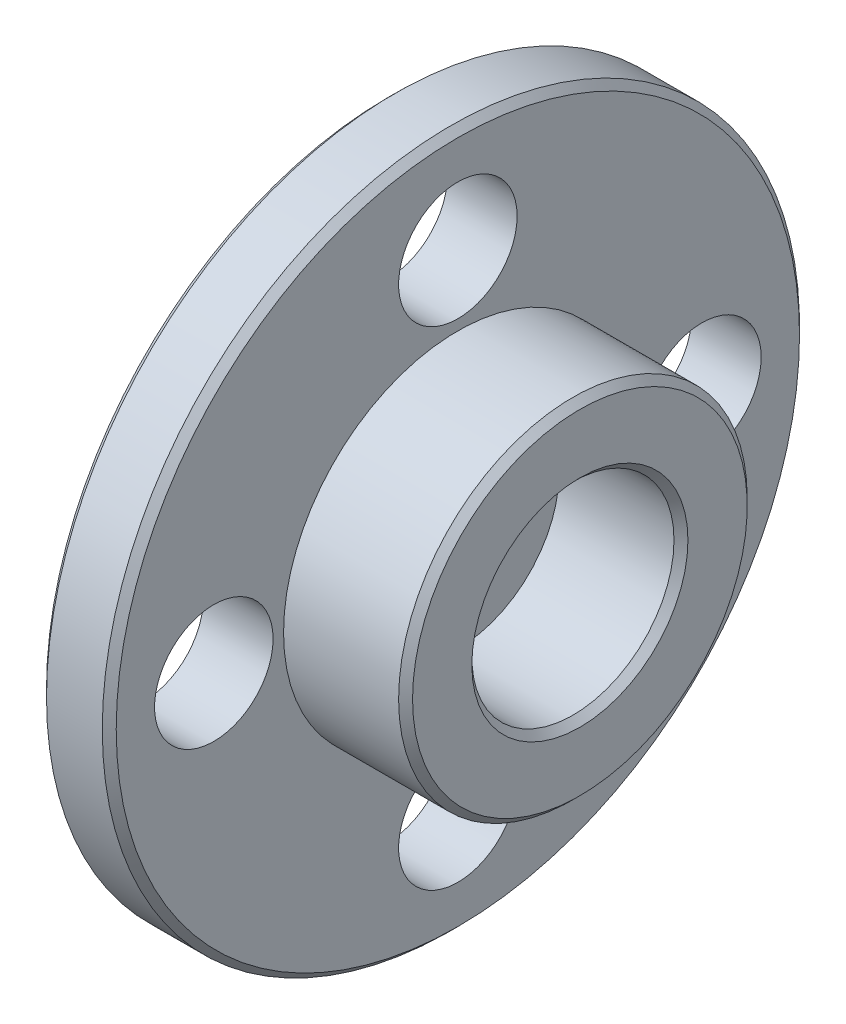
ISO-10303-21;
HEADER;
FILE_DESCRIPTION(('STEP AP214'),'2;1');
FILE_NAME('part.step','',(''),(''),'','','');
FILE_SCHEMA(('AUTOMOTIVE_DESIGN { 1 0 10303 214 1 1 1 1 }'));
ENDSEC;
DATA;
#1=APPLICATION_CONTEXT('core data for automotive mechanical design processes');
#2=APPLICATION_PROTOCOL_DEFINITION('international standard','automotive_design',2000,#1);
#3=PRODUCT_CONTEXT('',#1,'mechanical');
#4=PRODUCT('Part','Part','',(#3));
#5=PRODUCT_RELATED_PRODUCT_CATEGORY('part','',(#4));
#6=PRODUCT_DEFINITION_FORMATION('','',#4);
#7=PRODUCT_DEFINITION_CONTEXT('part definition',#1,'design');
#8=PRODUCT_DEFINITION('design','',#6,#7);
#9=PRODUCT_DEFINITION_SHAPE('','',#8);
#10=(LENGTH_UNIT() NAMED_UNIT(*) SI_UNIT(.MILLI.,.METRE.));
#11=(NAMED_UNIT(*) PLANE_ANGLE_UNIT() SI_UNIT($,.RADIAN.));
#12=(NAMED_UNIT(*) SI_UNIT($,.STERADIAN.) SOLID_ANGLE_UNIT());
#13=UNCERTAINTY_MEASURE_WITH_UNIT(LENGTH_MEASURE(1.E-05),#10,'distance_accuracy_value','');
#14=(GEOMETRIC_REPRESENTATION_CONTEXT(3) GLOBAL_UNCERTAINTY_ASSIGNED_CONTEXT((#13)) GLOBAL_UNIT_ASSIGNED_CONTEXT((#10,
#11,#12)) REPRESENTATION_CONTEXT('',''));
#15=CARTESIAN_POINT('',(0.,0.,0.));
#16=DIRECTION('',(0.,0.,1.));
#17=DIRECTION('',(1.,0.,0.));
#18=AXIS2_PLACEMENT_3D('',#15,#16,#17);
#19=CARTESIAN_POINT('',(0.,0.,0.));
#20=DIRECTION('',(1.,0.,0.));
#21=DIRECTION('',(0.,0.,-1.));
#22=AXIS2_PLACEMENT_3D('',#19,#20,#21);
#23=PLANE('',#22);
#24=CARTESIAN_POINT('',(0.,0.,0.));
#25=DIRECTION('',(1.,0.,0.));
#26=DIRECTION('',(0.,0.,-1.));
#27=AXIS2_PLACEMENT_3D('',#24,#25,#26);
#28=CIRCLE('',#27,1.70000000000002);
#29=CARTESIAN_POINT('',(0.,0.,-1.70000000000002));
#30=VERTEX_POINT('',#29);
#31=EDGE_CURVE('E63',#30,#30,#28,.T.);
#32=ORIENTED_EDGE('',*,*,#31,.T.);
#33=EDGE_LOOP('',(#32));
#34=FACE_BOUND('',#33,.T.);
#35=CARTESIAN_POINT('',(0.,0.,0.));
#36=DIRECTION('',(1.,0.,0.));
#37=DIRECTION('',(0.,0.,-1.));
#38=AXIS2_PLACEMENT_3D('',#35,#36,#37);
#39=CIRCLE('',#38,9.8);
#40=CARTESIAN_POINT('',(0.,0.,-9.8));
#41=VERTEX_POINT('',#40);
#42=EDGE_CURVE('E66',#41,#41,#39,.F.);
#43=ORIENTED_EDGE('',*,*,#42,.T.);
#44=EDGE_LOOP('',(#43));
#45=FACE_BOUND('',#44,.T.);
#46=CARTESIAN_POINT('',(0.,7.,0.));
#47=DIRECTION('',(1.,0.,0.));
#48=DIRECTION('',(0.,0.,-1.));
#49=AXIS2_PLACEMENT_3D('',#46,#47,#48);
#50=CIRCLE('',#49,1.7);
#51=CARTESIAN_POINT('',(0.,7.,-1.7));
#52=VERTEX_POINT('',#51);
#53=EDGE_CURVE('E99',#52,#52,#50,.T.);
#54=ORIENTED_EDGE('',*,*,#53,.T.);
#55=EDGE_LOOP('',(#54));
#56=FACE_BOUND('',#55,.T.);
#57=CARTESIAN_POINT('',(0.,-7.,0.));
#58=DIRECTION('',(1.,0.,0.));
#59=DIRECTION('',(0.,0.,-1.));
#60=AXIS2_PLACEMENT_3D('',#57,#58,#59);
#61=CIRCLE('',#60,1.7);
#62=CARTESIAN_POINT('',(0.,-7.,-1.7));
#63=VERTEX_POINT('',#62);
#64=EDGE_CURVE('E93',#63,#63,#61,.T.);
#65=ORIENTED_EDGE('',*,*,#64,.T.);
#66=EDGE_LOOP('',(#65));
#67=FACE_BOUND('',#66,.T.);
#68=CARTESIAN_POINT('',(0.,0.,7.));
#69=DIRECTION('',(1.,0.,0.));
#70=DIRECTION('',(0.,0.,-1.));
#71=AXIS2_PLACEMENT_3D('',#68,#69,#70);
#72=CIRCLE('',#71,1.7);
#73=CARTESIAN_POINT('',(0.,0.,5.3));
#74=VERTEX_POINT('',#73);
#75=EDGE_CURVE('E87',#74,#74,#72,.T.);
#76=ORIENTED_EDGE('',*,*,#75,.T.);
#77=EDGE_LOOP('',(#76));
#78=FACE_BOUND('',#77,.T.);
#79=CARTESIAN_POINT('',(0.,0.,-7.));
#80=DIRECTION('',(1.,0.,0.));
#81=DIRECTION('',(0.,0.,-1.));
#82=AXIS2_PLACEMENT_3D('',#79,#80,#81);
#83=CIRCLE('',#82,1.7);
#84=CARTESIAN_POINT('',(0.,0.,-8.7));
#85=VERTEX_POINT('',#84);
#86=EDGE_CURVE('E81',#85,#85,#83,.T.);
#87=ORIENTED_EDGE('',*,*,#86,.T.);
#88=EDGE_LOOP('',(#87));
#89=FACE_BOUND('',#88,.T.);
#90=ADVANCED_FACE('F34',(#34,#45,#56,#67,#78,#89),#23,.F.);
#91=CARTESIAN_POINT('',(0.,0.,0.));
#92=DIRECTION('',(-1.,0.,0.));
#93=DIRECTION('',(0.,0.,1.));
#94=AXIS2_PLACEMENT_3D('',#91,#92,#93);
#95=CYLINDRICAL_SURFACE('',#94,10.);
#96=CARTESIAN_POINT('',(0.200000000000002,0.,0.));
#97=DIRECTION('',(1.,0.,0.));
#98=DIRECTION('',(0.,0.,-1.));
#99=AXIS2_PLACEMENT_3D('',#96,#97,#98);
#100=CIRCLE('',#99,10.);
#101=CARTESIAN_POINT('',(0.200000000000002,0.,-10.));
#102=VERTEX_POINT('',#101);
#103=EDGE_CURVE('E41',#102,#102,#100,.T.);
#104=ORIENTED_EDGE('',*,*,#103,.T.);
#105=EDGE_LOOP('',(#104));
#106=FACE_BOUND('',#105,.T.);
#107=CARTESIAN_POINT('',(1.8,0.,0.));
#108=DIRECTION('',(-1.,0.,0.));
#109=DIRECTION('',(0.,0.,1.));
#110=AXIS2_PLACEMENT_3D('',#107,#108,#109);
#111=CIRCLE('',#110,10.);
#112=CARTESIAN_POINT('',(1.8,0.,10.));
#113=VERTEX_POINT('',#112);
#114=EDGE_CURVE('E45',#113,#113,#111,.T.);
#115=ORIENTED_EDGE('',*,*,#114,.T.);
#116=EDGE_LOOP('',(#115));
#117=FACE_BOUND('',#116,.T.);
#118=ADVANCED_FACE('F113',(#106,#117),#95,.T.);
#119=CARTESIAN_POINT('',(2.,10.,0.));
#120=DIRECTION('',(-1.,0.,0.));
#121=DIRECTION('',(0.,0.,1.));
#122=AXIS2_PLACEMENT_3D('',#119,#120,#121);
#123=PLANE('',#122);
#124=CARTESIAN_POINT('',(2.,0.,0.));
#125=DIRECTION('',(-1.,0.,0.));
#126=DIRECTION('',(0.,0.,1.));
#127=AXIS2_PLACEMENT_3D('',#124,#125,#126);
#128=CIRCLE('',#127,9.8);
#129=CARTESIAN_POINT('',(2.,0.,9.8));
#130=VERTEX_POINT('',#129);
#131=EDGE_CURVE('E10',#130,#130,#128,.F.);
#132=ORIENTED_EDGE('',*,*,#131,.T.);
#133=EDGE_LOOP('',(#132));
#134=FACE_BOUND('',#133,.T.);
#135=CARTESIAN_POINT('',(2.,7.,0.));
#136=DIRECTION('',(1.,0.,0.));
#137=DIRECTION('',(0.,0.,-1.));
#138=AXIS2_PLACEMENT_3D('',#135,#136,#137);
#139=CIRCLE('',#138,1.7);
#140=CARTESIAN_POINT('',(2.,7.,-1.7));
#141=VERTEX_POINT('',#140);
#142=EDGE_CURVE('E102',#141,#141,#139,.T.);
#143=ORIENTED_EDGE('',*,*,#142,.F.);
#144=EDGE_LOOP('',(#143));
#145=FACE_BOUND('',#144,.T.);
#146=CARTESIAN_POINT('',(2.,-7.,0.));
#147=DIRECTION('',(1.,0.,0.));
#148=DIRECTION('',(0.,0.,-1.));
#149=AXIS2_PLACEMENT_3D('',#146,#147,#148);
#150=CIRCLE('',#149,1.7);
#151=CARTESIAN_POINT('',(2.,-7.,-1.7));
#152=VERTEX_POINT('',#151);
#153=EDGE_CURVE('E96',#152,#152,#150,.T.);
#154=ORIENTED_EDGE('',*,*,#153,.F.);
#155=EDGE_LOOP('',(#154));
#156=FACE_BOUND('',#155,.T.);
#157=CARTESIAN_POINT('',(2.,0.,7.));
#158=DIRECTION('',(1.,0.,0.));
#159=DIRECTION('',(0.,0.,-1.));
#160=AXIS2_PLACEMENT_3D('',#157,#158,#159);
#161=CIRCLE('',#160,1.7);
#162=CARTESIAN_POINT('',(2.,0.,5.3));
#163=VERTEX_POINT('',#162);
#164=EDGE_CURVE('E90',#163,#163,#161,.T.);
#165=ORIENTED_EDGE('',*,*,#164,.F.);
#166=EDGE_LOOP('',(#165));
#167=FACE_BOUND('',#166,.T.);
#168=CARTESIAN_POINT('',(2.,0.,-7.));
#169=DIRECTION('',(1.,0.,0.));
#170=DIRECTION('',(0.,0.,-1.));
#171=AXIS2_PLACEMENT_3D('',#168,#169,#170);
#172=CIRCLE('',#171,1.7);
#173=CARTESIAN_POINT('',(2.,0.,-8.7));
#174=VERTEX_POINT('',#173);
#175=EDGE_CURVE('E84',#174,#174,#172,.T.);
#176=ORIENTED_EDGE('',*,*,#175,.F.);
#177=EDGE_LOOP('',(#176));
#178=FACE_BOUND('',#177,.T.);
#179=CARTESIAN_POINT('',(2.,0.,0.));
#180=DIRECTION('',(-1.,0.,0.));
#181=DIRECTION('',(0.,0.,1.));
#182=AXIS2_PLACEMENT_3D('',#179,#180,#181);
#183=CIRCLE('',#182,5.);
#184=CARTESIAN_POINT('',(2.,0.,5.));
#185=VERTEX_POINT('',#184);
#186=EDGE_CURVE('E72',#185,#185,#183,.T.);
#187=ORIENTED_EDGE('',*,*,#186,.T.);
#188=EDGE_LOOP('',(#187));
#189=FACE_BOUND('',#188,.T.);
#190=ADVANCED_FACE('F109',(#134,#145,#156,#167,#178,#189),#123,.F.);
#191=CARTESIAN_POINT('',(0.,0.,0.));
#192=DIRECTION('',(-1.,0.,0.));
#193=DIRECTION('',(0.,0.,1.));
#194=AXIS2_PLACEMENT_3D('',#191,#192,#193);
#195=CYLINDRICAL_SURFACE('',#194,5.);
#196=CARTESIAN_POINT('',(5.3,0.,0.));
#197=DIRECTION('',(-1.,0.,0.));
#198=DIRECTION('',(0.,0.,1.));
#199=AXIS2_PLACEMENT_3D('',#196,#197,#198);
#200=CIRCLE('',#199,5.);
#201=CARTESIAN_POINT('',(5.3,0.,5.));
#202=VERTEX_POINT('',#201);
#203=EDGE_CURVE('E49',#202,#202,#200,.T.);
#204=ORIENTED_EDGE('',*,*,#203,.T.);
#205=EDGE_LOOP('',(#204));
#206=FACE_BOUND('',#205,.T.);
#207=ORIENTED_EDGE('',*,*,#186,.F.);
#208=EDGE_LOOP('',(#207));
#209=FACE_BOUND('',#208,.T.);
#210=ADVANCED_FACE('F112',(#206,#209),#195,.T.);
#211=CARTESIAN_POINT('',(5.5,5.,0.));
#212=DIRECTION('',(-1.,0.,0.));
#213=DIRECTION('',(0.,0.,1.));
#214=AXIS2_PLACEMENT_3D('',#211,#212,#213);
#215=PLANE('',#214);
#216=CARTESIAN_POINT('',(5.5,0.,0.));
#217=DIRECTION('',(-1.,0.,0.));
#218=DIRECTION('',(0.,0.,1.));
#219=AXIS2_PLACEMENT_3D('',#216,#217,#218);
#220=CIRCLE('',#219,3.1);
#221=CARTESIAN_POINT('',(5.5,0.,-3.1));
#222=VERTEX_POINT('',#221);
#223=EDGE_CURVE('E54',#222,#222,#220,.T.);
#224=ORIENTED_EDGE('',*,*,#223,.T.);
#225=EDGE_LOOP('',(#224));
#226=FACE_BOUND('',#225,.T.);
#227=CARTESIAN_POINT('',(5.5,0.,0.));
#228=DIRECTION('',(-1.,0.,0.));
#229=DIRECTION('',(0.,0.,1.));
#230=AXIS2_PLACEMENT_3D('',#227,#228,#229);
#231=CIRCLE('',#230,4.8);
#232=CARTESIAN_POINT('',(5.5,0.,4.8));
#233=VERTEX_POINT('',#232);
#234=EDGE_CURVE('E57',#233,#233,#231,.F.);
#235=ORIENTED_EDGE('',*,*,#234,.T.);
#236=EDGE_LOOP('',(#235));
#237=FACE_BOUND('',#236,.T.);
#238=ADVANCED_FACE('F124',(#226,#237),#215,.F.);
#239=CARTESIAN_POINT('',(2.,0.,0.));
#240=DIRECTION('',(1.,0.,0.));
#241=DIRECTION('',(0.,0.,-1.));
#242=AXIS2_PLACEMENT_3D('',#239,#240,#241);
#243=CYLINDRICAL_SURFACE('',#242,2.9);
#244=CARTESIAN_POINT('',(5.30000000000001,0.,0.));
#245=DIRECTION('',(-1.,0.,0.));
#246=DIRECTION('',(0.,0.,1.));
#247=AXIS2_PLACEMENT_3D('',#244,#245,#246);
#248=CIRCLE('',#247,2.9);
#249=CARTESIAN_POINT('',(5.30000000000001,0.,-2.9));
#250=VERTEX_POINT('',#249);
#251=EDGE_CURVE('E60',#250,#250,#248,.F.);
#252=ORIENTED_EDGE('',*,*,#251,.T.);
#253=EDGE_LOOP('',(#252));
#254=FACE_BOUND('',#253,.T.);
#255=CARTESIAN_POINT('',(2.,0.,0.));
#256=DIRECTION('',(1.,0.,0.));
#257=DIRECTION('',(0.,0.,-1.));
#258=AXIS2_PLACEMENT_3D('',#255,#256,#257);
#259=CIRCLE('',#258,2.9);
#260=CARTESIAN_POINT('',(2.,0.,-2.9));
#261=VERTEX_POINT('',#260);
#262=EDGE_CURVE('E75',#261,#261,#259,.T.);
#263=ORIENTED_EDGE('',*,*,#262,.F.);
#264=EDGE_LOOP('',(#263));
#265=FACE_BOUND('',#264,.T.);
#266=ADVANCED_FACE('F130',(#254,#265),#243,.F.);
#267=CARTESIAN_POINT('',(2.,0.,0.));
#268=DIRECTION('',(1.,0.,0.));
#269=DIRECTION('',(0.,0.,-1.));
#270=AXIS2_PLACEMENT_3D('',#267,#268,#269);
#271=PLANE('',#270);
#272=CARTESIAN_POINT('',(2.,0.,0.));
#273=DIRECTION('',(1.,0.,0.));
#274=DIRECTION('',(0.,0.,-1.));
#275=AXIS2_PLACEMENT_3D('',#272,#273,#274);
#276=CIRCLE('',#275,1.5);
#277=CARTESIAN_POINT('',(2.,0.,1.5));
#278=VERTEX_POINT('',#277);
#279=EDGE_CURVE('E78',#278,#278,#276,.F.);
#280=ORIENTED_EDGE('',*,*,#279,.T.);
#281=EDGE_LOOP('',(#280));
#282=FACE_BOUND('',#281,.T.);
#283=ORIENTED_EDGE('',*,*,#262,.T.);
#284=EDGE_LOOP('',(#283));
#285=FACE_BOUND('',#284,.T.);
#286=ADVANCED_FACE('F184',(#282,#285),#271,.T.);
#287=CARTESIAN_POINT('',(5.501,0.,0.));
#288=DIRECTION('',(-1.,0.,0.));
#289=DIRECTION('',(0.,0.,1.));
#290=AXIS2_PLACEMENT_3D('',#287,#288,#289);
#291=CYLINDRICAL_SURFACE('',#290,1.5);
#292=CARTESIAN_POINT('',(0.200000000000019,0.,0.));
#293=DIRECTION('',(1.,0.,0.));
#294=DIRECTION('',(0.,0.,-1.));
#295=AXIS2_PLACEMENT_3D('',#292,#293,#294);
#296=CIRCLE('',#295,1.5);
#297=CARTESIAN_POINT('',(0.200000000000018,0.,1.5));
#298=VERTEX_POINT('',#297);
#299=EDGE_CURVE('E69',#298,#298,#296,.F.);
#300=CARTESIAN_POINT('',(0.200000000000018,0.,1.5));
#301=CARTESIAN_POINT('',(0.218750000000018,0.,1.5));
#302=CARTESIAN_POINT('',(0.237500000000017,0.,1.5));
#303=CARTESIAN_POINT('',(0.275000000000017,0.,1.5));
#304=CARTESIAN_POINT('',(0.293750000000017,0.,1.5));
#305=CARTESIAN_POINT('',(0.331250000000017,0.,1.5));
#306=CARTESIAN_POINT('',(0.350000000000017,0.,1.5));
#307=CARTESIAN_POINT('',(0.387500000000016,0.,1.5));
#308=CARTESIAN_POINT('',(0.406250000000016,0.,1.5));
#309=CARTESIAN_POINT('',(0.443750000000015,0.,1.5));
#310=CARTESIAN_POINT('',(0.462500000000015,0.,1.5));
#311=CARTESIAN_POINT('',(0.500000000000015,0.,1.5));
#312=CARTESIAN_POINT('',(0.518750000000015,0.,1.5));
#313=CARTESIAN_POINT('',(0.556250000000015,0.,1.5));
#314=CARTESIAN_POINT('',(0.575000000000014,0.,1.5));
#315=CARTESIAN_POINT('',(0.612500000000014,0.,1.5));
#316=CARTESIAN_POINT('',(0.631250000000014,0.,1.5));
#317=CARTESIAN_POINT('',(0.668750000000013,0.,1.5));
#318=CARTESIAN_POINT('',(0.687500000000013,0.,1.5));
#319=CARTESIAN_POINT('',(0.725000000000012,0.,1.5));
#320=CARTESIAN_POINT('',(0.743750000000012,0.,1.5));
#321=CARTESIAN_POINT('',(0.781250000000012,0.,1.5));
#322=CARTESIAN_POINT('',(0.800000000000012,0.,1.5));
#323=CARTESIAN_POINT('',(0.837500000000012,0.,1.5));
#324=CARTESIAN_POINT('',(0.856250000000012,0.,1.5));
#325=CARTESIAN_POINT('',(0.893750000000011,0.,1.5));
#326=CARTESIAN_POINT('',(0.912500000000011,0.,1.5));
#327=CARTESIAN_POINT('',(0.95000000000001,0.,1.5));
#328=CARTESIAN_POINT('',(0.96875000000001,0.,1.5));
#329=CARTESIAN_POINT('',(1.00625000000001,0.,1.5));
#330=CARTESIAN_POINT('',(1.02500000000001,0.,1.5));
#331=CARTESIAN_POINT('',(1.06250000000001,0.,1.5));
#332=CARTESIAN_POINT('',(1.08125000000001,0.,1.5));
#333=CARTESIAN_POINT('',(1.11875000000001,0.,1.5));
#334=CARTESIAN_POINT('',(1.13750000000001,0.,1.5));
#335=CARTESIAN_POINT('',(1.17500000000001,0.,1.5));
#336=CARTESIAN_POINT('',(1.19375000000001,0.,1.5));
#337=CARTESIAN_POINT('',(1.23125000000001,0.,1.5));
#338=CARTESIAN_POINT('',(1.25000000000001,0.,1.5));
#339=CARTESIAN_POINT('',(1.28750000000001,0.,1.5));
#340=CARTESIAN_POINT('',(1.30625000000001,0.,1.5));
#341=CARTESIAN_POINT('',(1.34375000000001,0.,1.5));
#342=CARTESIAN_POINT('',(1.36250000000001,0.,1.5));
#343=CARTESIAN_POINT('',(1.40000000000001,0.,1.5));
#344=CARTESIAN_POINT('',(1.41875000000001,0.,1.5));
#345=CARTESIAN_POINT('',(1.45625000000001,0.,1.5));
#346=CARTESIAN_POINT('',(1.47500000000001,0.,1.5));
#347=CARTESIAN_POINT('',(1.51250000000001,0.,1.5));
#348=CARTESIAN_POINT('',(1.53125,0.,1.5));
#349=CARTESIAN_POINT('',(1.56875,0.,1.5));
#350=CARTESIAN_POINT('',(1.5875,0.,1.5));
#351=CARTESIAN_POINT('',(1.625,0.,1.5));
#352=CARTESIAN_POINT('',(1.64375,0.,1.5));
#353=CARTESIAN_POINT('',(1.68125,0.,1.5));
#354=CARTESIAN_POINT('',(1.7,0.,1.5));
#355=CARTESIAN_POINT('',(1.7375,0.,1.5));
#356=CARTESIAN_POINT('',(1.75625,0.,1.5));
#357=CARTESIAN_POINT('',(1.79375,0.,1.5));
#358=CARTESIAN_POINT('',(1.8125,0.,1.5));
#359=CARTESIAN_POINT('',(1.85,0.,1.5));
#360=CARTESIAN_POINT('',(1.86875,0.,1.5));
#361=CARTESIAN_POINT('',(1.90625,0.,1.5));
#362=CARTESIAN_POINT('',(1.925,0.,1.5));
#363=CARTESIAN_POINT('',(1.9625,0.,1.5));
#364=CARTESIAN_POINT('',(1.98125,0.,1.5));
#365=CARTESIAN_POINT('',(2.,0.,1.5));
#366=B_SPLINE_CURVE_WITH_KNOTS('',3,(#300,#301,#302,#303,#304,#305,#306,#307,#308,#309,#310,
#311,#312,#313,#314,#315,#316,#317,#318,#319,#320,#321,#322,#323,#324,#325,#326,#327,#328,#329,
#330,#331,#332,#333,#334,#335,#336,#337,#338,#339,#340,#341,#342,#343,#344,#345,#346,#347,#348,
#349,#350,#351,#352,#353,#354,#355,#356,#357,#358,#359,#360,#361,#362,#363,#364,#365),
.UNSPECIFIED.,.F.,.F.,(4,2,2,2,2,2,2,2,2,2,2,2,2,2,2,2,2,2,2,2,2,2,2,2,2,2,2,2,2,2,2,2,4),(0.,
0.056249999999999,0.112499999999999,0.168749999999999,0.224999999999998,0.281249999999997,
0.337499999999997,0.393749999999997,0.449999999999996,0.506249999999995,0.562499999999994,
0.618749999999994,0.674999999999993,0.731249999999992,0.787499999999992,0.843749999999992,
0.899999999999991,0.95624999999999,1.01249999999999,1.06874999999999,1.12499999999999,
1.18124999999999,1.23749999999999,1.29374999999999,1.34999999999999,1.40624999999999,
1.46249999999999,1.51874999999998,1.57499999999998,1.63124999999998,1.68749999999998,
1.74374999999998,1.79999999999998),.UNSPECIFIED.);
#367=EDGE_CURVE('BSEAM174',#298,#278,#366,.T.);
#368=ORIENTED_EDGE('',*,*,#299,.T.);
#369=ORIENTED_EDGE('',*,*,#279,.F.);
#370=ORIENTED_EDGE('',*,*,#367,.T.);
#371=ORIENTED_EDGE('',*,*,#367,.F.);
#372=EDGE_LOOP('',(#368,#370,#369,#371));
#373=FACE_BOUND('',#372,.T.);
#374=ADVANCED_FACE('F174',(#373),#291,.F.);
#375=CARTESIAN_POINT('',(2.,0.,-7.));
#376=DIRECTION('',(1.,0.,0.));
#377=DIRECTION('',(0.,0.,-1.));
#378=AXIS2_PLACEMENT_3D('',#375,#376,#377);
#379=CYLINDRICAL_SURFACE('',#378,1.7);
#380=ORIENTED_EDGE('',*,*,#175,.T.);
#381=EDGE_LOOP('',(#380));
#382=FACE_BOUND('',#381,.T.);
#383=ORIENTED_EDGE('',*,*,#86,.F.);
#384=EDGE_LOOP('',(#383));
#385=FACE_BOUND('',#384,.T.);
#386=ADVANCED_FACE('F171',(#382,#385),#379,.F.);
#387=CARTESIAN_POINT('',(2.,0.,7.));
#388=DIRECTION('',(1.,0.,0.));
#389=DIRECTION('',(0.,0.,-1.));
#390=AXIS2_PLACEMENT_3D('',#387,#388,#389);
#391=CYLINDRICAL_SURFACE('',#390,1.7);
#392=ORIENTED_EDGE('',*,*,#164,.T.);
#393=EDGE_LOOP('',(#392));
#394=FACE_BOUND('',#393,.T.);
#395=ORIENTED_EDGE('',*,*,#75,.F.);
#396=EDGE_LOOP('',(#395));
#397=FACE_BOUND('',#396,.T.);
#398=ADVANCED_FACE('F173',(#394,#397),#391,.F.);
#399=CARTESIAN_POINT('',(2.,-7.,0.));
#400=DIRECTION('',(1.,0.,0.));
#401=DIRECTION('',(0.,0.,-1.));
#402=AXIS2_PLACEMENT_3D('',#399,#400,#401);
#403=CYLINDRICAL_SURFACE('',#402,1.7);
#404=ORIENTED_EDGE('',*,*,#153,.T.);
#405=EDGE_LOOP('',(#404));
#406=FACE_BOUND('',#405,.T.);
#407=ORIENTED_EDGE('',*,*,#64,.F.);
#408=EDGE_LOOP('',(#407));
#409=FACE_BOUND('',#408,.T.);
#410=ADVANCED_FACE('F181',(#406,#409),#403,.F.);
#411=CARTESIAN_POINT('',(2.,7.,0.));
#412=DIRECTION('',(1.,0.,0.));
#413=DIRECTION('',(0.,0.,-1.));
#414=AXIS2_PLACEMENT_3D('',#411,#412,#413);
#415=CYLINDRICAL_SURFACE('',#414,1.7);
#416=ORIENTED_EDGE('',*,*,#142,.T.);
#417=EDGE_LOOP('',(#416));
#418=FACE_BOUND('',#417,.T.);
#419=ORIENTED_EDGE('',*,*,#53,.F.);
#420=EDGE_LOOP('',(#419));
#421=FACE_BOUND('',#420,.T.);
#422=ADVANCED_FACE('F106',(#418,#421),#415,.F.);
#423=CARTESIAN_POINT('',(0.200000000000019,0.,0.));
#424=DIRECTION('',(-1.,0.,0.));
#425=DIRECTION('',(0.,0.,1.));
#426=AXIS2_PLACEMENT_3D('',#423,#424,#425);
#427=CONICAL_SURFACE('',#426,1.5,0.785398163397453);
#428=ORIENTED_EDGE('',*,*,#31,.F.);
#429=EDGE_LOOP('',(#428));
#430=FACE_BOUND('',#429,.T.);
#431=ORIENTED_EDGE('',*,*,#299,.F.);
#432=EDGE_LOOP('',(#431));
#433=FACE_BOUND('',#432,.T.);
#434=ADVANCED_FACE('F142',(#430,#433),#427,.F.);
#435=CARTESIAN_POINT('',(5.30000000000001,0.,0.));
#436=DIRECTION('',(1.,0.,0.));
#437=DIRECTION('',(0.,0.,-1.));
#438=AXIS2_PLACEMENT_3D('',#435,#436,#437);
#439=CONICAL_SURFACE('',#438,2.9,0.785398163397453);
#440=CARTESIAN_POINT('',(5.5,0.,-3.1));
#441=CARTESIAN_POINT('',(5.49791666666667,0.,-3.09791666666666));
#442=CARTESIAN_POINT('',(5.49583333333333,0.,-3.09583333333333));
#443=CARTESIAN_POINT('',(5.49166666666667,0.,-3.09166666666666));
#444=CARTESIAN_POINT('',(5.48958333333333,0.,-3.08958333333333));
#445=CARTESIAN_POINT('',(5.48541666666667,0.,-3.08541666666666));
#446=CARTESIAN_POINT('',(5.48333333333333,0.,-3.08333333333333));
#447=CARTESIAN_POINT('',(5.47916666666667,0.,-3.07916666666666));
#448=CARTESIAN_POINT('',(5.47708333333333,0.,-3.07708333333333));
#449=CARTESIAN_POINT('',(5.47291666666667,0.,-3.07291666666666));
#450=CARTESIAN_POINT('',(5.47083333333333,0.,-3.07083333333333));
#451=CARTESIAN_POINT('',(5.46666666666667,0.,-3.06666666666666));
#452=CARTESIAN_POINT('',(5.46458333333333,0.,-3.06458333333333));
#453=CARTESIAN_POINT('',(5.46041666666667,0.,-3.06041666666666));
#454=CARTESIAN_POINT('',(5.45833333333333,0.,-3.05833333333333));
#455=CARTESIAN_POINT('',(5.45416666666667,0.,-3.05416666666666));
#456=CARTESIAN_POINT('',(5.45208333333334,0.,-3.05208333333333));
#457=CARTESIAN_POINT('',(5.44791666666667,0.,-3.04791666666666));
#458=CARTESIAN_POINT('',(5.44583333333333,0.,-3.04583333333333));
#459=CARTESIAN_POINT('',(5.44166666666667,0.,-3.04166666666666));
#460=CARTESIAN_POINT('',(5.43958333333333,0.,-3.03958333333333));
#461=CARTESIAN_POINT('',(5.43541666666667,0.,-3.03541666666666));
#462=CARTESIAN_POINT('',(5.43333333333334,0.,-3.03333333333333));
#463=CARTESIAN_POINT('',(5.42916666666667,0.,-3.02916666666666));
#464=CARTESIAN_POINT('',(5.42708333333334,0.,-3.02708333333333));
#465=CARTESIAN_POINT('',(5.42291666666667,0.,-3.02291666666666));
#466=CARTESIAN_POINT('',(5.42083333333334,0.,-3.02083333333333));
#467=CARTESIAN_POINT('',(5.41666666666667,0.,-3.01666666666666));
#468=CARTESIAN_POINT('',(5.41458333333334,0.,-3.01458333333333));
#469=CARTESIAN_POINT('',(5.41041666666667,0.,-3.01041666666666));
#470=CARTESIAN_POINT('',(5.40833333333334,0.,-3.00833333333333));
#471=CARTESIAN_POINT('',(5.40416666666667,0.,-3.00416666666666));
#472=CARTESIAN_POINT('',(5.40208333333334,0.,-3.00208333333333));
#473=CARTESIAN_POINT('',(5.39791666666667,0.,-2.99791666666666));
#474=CARTESIAN_POINT('',(5.39583333333334,0.,-2.99583333333333));
#475=CARTESIAN_POINT('',(5.39166666666667,0.,-2.99166666666666));
#476=CARTESIAN_POINT('',(5.38958333333334,0.,-2.98958333333333));
#477=CARTESIAN_POINT('',(5.38541666666667,0.,-2.98541666666666));
#478=CARTESIAN_POINT('',(5.38333333333334,0.,-2.98333333333333));
#479=CARTESIAN_POINT('',(5.37916666666667,0.,-2.97916666666666));
#480=CARTESIAN_POINT('',(5.37708333333334,0.,-2.97708333333333));
#481=CARTESIAN_POINT('',(5.37291666666667,0.,-2.97291666666667));
#482=CARTESIAN_POINT('',(5.37083333333334,0.,-2.97083333333333));
#483=CARTESIAN_POINT('',(5.36666666666667,0.,-2.96666666666667));
#484=CARTESIAN_POINT('',(5.36458333333334,0.,-2.96458333333333));
#485=CARTESIAN_POINT('',(5.36041666666667,0.,-2.96041666666667));
#486=CARTESIAN_POINT('',(5.35833333333334,0.,-2.95833333333333));
#487=CARTESIAN_POINT('',(5.35416666666667,0.,-2.95416666666667));
#488=CARTESIAN_POINT('',(5.35208333333334,0.,-2.95208333333333));
#489=CARTESIAN_POINT('',(5.34791666666667,0.,-2.94791666666667));
#490=CARTESIAN_POINT('',(5.34583333333334,0.,-2.94583333333333));
#491=CARTESIAN_POINT('',(5.34166666666667,0.,-2.94166666666667));
#492=CARTESIAN_POINT('',(5.33958333333334,0.,-2.93958333333333));
#493=CARTESIAN_POINT('',(5.33541666666667,0.,-2.93541666666667));
#494=CARTESIAN_POINT('',(5.33333333333334,0.,-2.93333333333333));
#495=CARTESIAN_POINT('',(5.32916666666667,0.,-2.92916666666667));
#496=CARTESIAN_POINT('',(5.32708333333334,0.,-2.92708333333333));
#497=CARTESIAN_POINT('',(5.32291666666667,0.,-2.92291666666667));
#498=CARTESIAN_POINT('',(5.32083333333334,0.,-2.92083333333333));
#499=CARTESIAN_POINT('',(5.31666666666667,0.,-2.91666666666667));
#500=CARTESIAN_POINT('',(5.31458333333334,0.,-2.91458333333333));
#501=CARTESIAN_POINT('',(5.31041666666667,0.,-2.91041666666667));
#502=CARTESIAN_POINT('',(5.30833333333334,0.,-2.90833333333333));
#503=CARTESIAN_POINT('',(5.30416666666667,0.,-2.90416666666667));
#504=CARTESIAN_POINT('',(5.30208333333334,0.,-2.90208333333333));
#505=CARTESIAN_POINT('',(5.30000000000001,0.,-2.9));
#506=B_SPLINE_CURVE_WITH_KNOTS('',3,(#440,#441,#442,#443,#444,#445,#446,#447,#448,#449,#450,
#451,#452,#453,#454,#455,#456,#457,#458,#459,#460,#461,#462,#463,#464,#465,#466,#467,#468,#469,
#470,#471,#472,#473,#474,#475,#476,#477,#478,#479,#480,#481,#482,#483,#484,#485,#486,#487,#488,
#489,#490,#491,#492,#493,#494,#495,#496,#497,#498,#499,#500,#501,#502,#503,#504,#505),
.UNSPECIFIED.,.F.,.F.,(4,2,2,2,2,2,2,2,2,2,2,2,2,2,2,2,2,2,2,2,2,2,2,2,2,2,2,2,2,2,2,2,4),(0.,
0.00883883476483179,0.0176776695296636,0.0265165042944951,0.0353553390593269,0.044194173824158,
0.0530330085889898,0.0618718433538213,0.0707106781186531,0.0795495128834849,0.0883883476483161,
0.0972271824131482,0.106066017177979,0.114904851942811,0.123743686707642,0.132582521472474,
0.141421356237306,0.150260191002137,0.159099025766969,0.167937860531801,0.176776695296632,
0.185615530061464,0.194454364826295,0.203293199591127,0.212132034355959,0.220970869120791,
0.229809703885622,0.238648538650454,0.247487373415285,0.256326208180117,0.265165042944948,
0.27400387770978,0.282842712474612),.UNSPECIFIED.);
#507=EDGE_CURVE('BSEAM145',#222,#250,#506,.T.);
#508=ORIENTED_EDGE('',*,*,#223,.F.);
#509=ORIENTED_EDGE('',*,*,#251,.F.);
#510=ORIENTED_EDGE('',*,*,#507,.T.);
#511=ORIENTED_EDGE('',*,*,#507,.F.);
#512=EDGE_LOOP('',(#508,#510,#509,#511));
#513=FACE_BOUND('',#512,.T.);
#514=ADVANCED_FACE('F145',(#513),#439,.F.);
#515=CARTESIAN_POINT('',(5.3,0.,0.));
#516=DIRECTION('',(-1.,0.,0.));
#517=DIRECTION('',(0.,0.,1.));
#518=AXIS2_PLACEMENT_3D('',#515,#516,#517);
#519=CONICAL_SURFACE('',#518,5.,0.785398163397455);
#520=ORIENTED_EDGE('',*,*,#234,.F.);
#521=EDGE_LOOP('',(#520));
#522=FACE_BOUND('',#521,.T.);
#523=ORIENTED_EDGE('',*,*,#203,.F.);
#524=EDGE_LOOP('',(#523));
#525=FACE_BOUND('',#524,.T.);
#526=ADVANCED_FACE('F149',(#522,#525),#519,.T.);
#527=CARTESIAN_POINT('',(0.,0.,0.));
#528=DIRECTION('',(1.,0.,0.));
#529=DIRECTION('',(0.,0.,-1.));
#530=AXIS2_PLACEMENT_3D('',#527,#528,#529);
#531=CONICAL_SURFACE('',#530,9.8,0.785398163397448);
#532=ORIENTED_EDGE('',*,*,#103,.F.);
#533=EDGE_LOOP('',(#532));
#534=FACE_BOUND('',#533,.T.);
#535=ORIENTED_EDGE('',*,*,#42,.F.);
#536=EDGE_LOOP('',(#535));
#537=FACE_BOUND('',#536,.T.);
#538=ADVANCED_FACE('F152',(#534,#537),#531,.T.);
#539=CARTESIAN_POINT('',(1.8,0.,0.));
#540=DIRECTION('',(-1.,0.,0.));
#541=DIRECTION('',(0.,0.,1.));
#542=AXIS2_PLACEMENT_3D('',#539,#540,#541);
#543=CONICAL_SURFACE('',#542,10.,0.785398163397457);
#544=ORIENTED_EDGE('',*,*,#131,.F.);
#545=EDGE_LOOP('',(#544));
#546=FACE_BOUND('',#545,.T.);
#547=ORIENTED_EDGE('',*,*,#114,.F.);
#548=EDGE_LOOP('',(#547));
#549=FACE_BOUND('',#548,.T.);
#550=ADVANCED_FACE('F36',(#546,#549),#543,.T.);
#551=CLOSED_SHELL('',(#90,#118,#190,#210,#238,#266,#286,#374,#386,#398,#410,#422,#434,#514,#526,
#538,#550));
#552=MANIFOLD_SOLID_BREP('B2',#551);
#553=ADVANCED_BREP_SHAPE_REPRESENTATION('',(#18,#552),#14);
#554=SHAPE_DEFINITION_REPRESENTATION(#9,#553);
ENDSEC;
END-ISO-10303-21;
